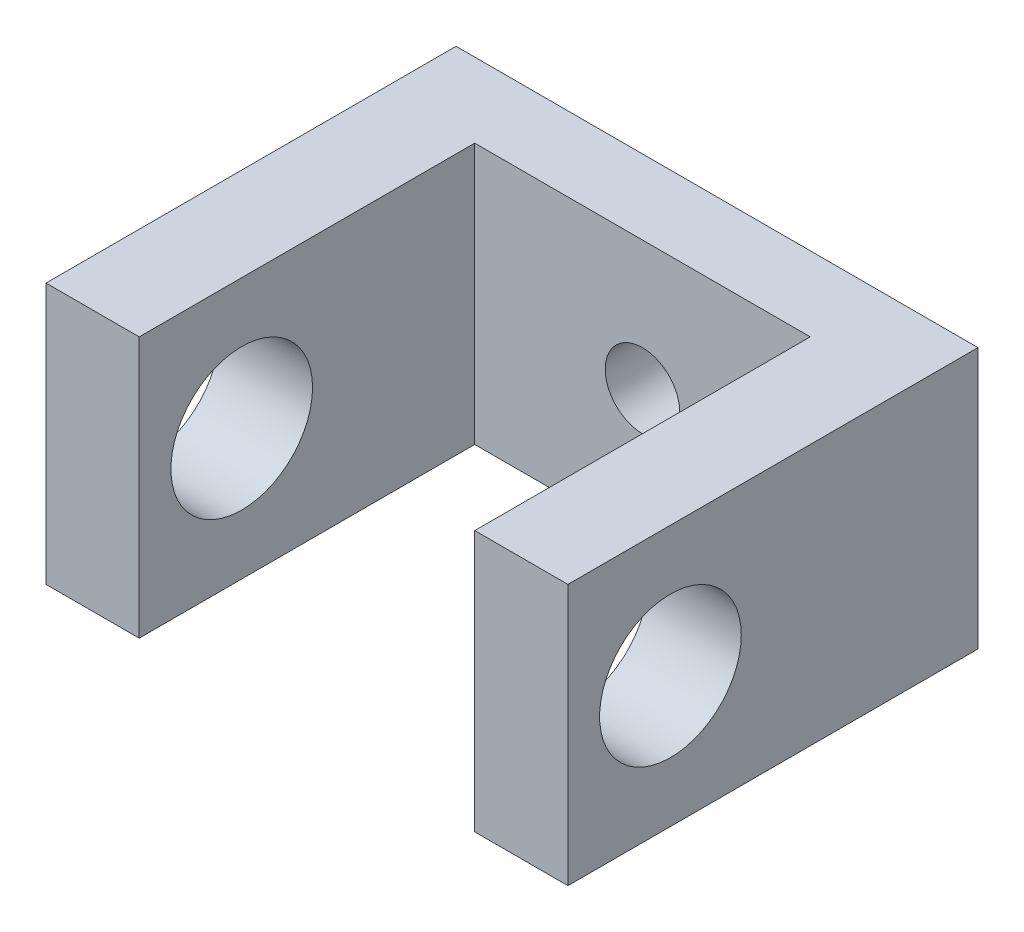
ISO-10303-21;
HEADER;
FILE_DESCRIPTION(('STEP AP214'),'2;1');
FILE_NAME('part.step','',(''),(''),'','','');
FILE_SCHEMA(('AUTOMOTIVE_DESIGN { 1 0 10303 214 1 1 1 1 }'));
ENDSEC;
DATA;
#1=APPLICATION_CONTEXT('core data for automotive mechanical design processes');
#2=APPLICATION_PROTOCOL_DEFINITION('international standard','automotive_design',2000,#1);
#3=PRODUCT_CONTEXT('',#1,'mechanical');
#4=PRODUCT('Part','Part','',(#3));
#5=PRODUCT_RELATED_PRODUCT_CATEGORY('part','',(#4));
#6=PRODUCT_DEFINITION_FORMATION('','',#4);
#7=PRODUCT_DEFINITION_CONTEXT('part definition',#1,'design');
#8=PRODUCT_DEFINITION('design','',#6,#7);
#9=PRODUCT_DEFINITION_SHAPE('','',#8);
#10=(LENGTH_UNIT() NAMED_UNIT(*) SI_UNIT(.MILLI.,.METRE.));
#11=(NAMED_UNIT(*) PLANE_ANGLE_UNIT() SI_UNIT($,.RADIAN.));
#12=(NAMED_UNIT(*) SI_UNIT($,.STERADIAN.) SOLID_ANGLE_UNIT());
#13=UNCERTAINTY_MEASURE_WITH_UNIT(LENGTH_MEASURE(1.E-05),#10,'distance_accuracy_value','');
#14=(GEOMETRIC_REPRESENTATION_CONTEXT(3) GLOBAL_UNCERTAINTY_ASSIGNED_CONTEXT((#13)) GLOBAL_UNIT_ASSIGNED_CONTEXT((#10,
#11,#12)) REPRESENTATION_CONTEXT('',''));
#15=CARTESIAN_POINT('',(0.,0.,0.));
#16=DIRECTION('',(0.,0.,1.));
#17=DIRECTION('',(1.,0.,0.));
#18=AXIS2_PLACEMENT_3D('',#15,#16,#17);
#19=CARTESIAN_POINT('',(0.,0.,22.));
#20=DIRECTION('',(0.,0.,-1.));
#21=DIRECTION('',(-1.,0.,0.));
#22=AXIS2_PLACEMENT_3D('',#19,#20,#21);
#23=PLANE('',#22);
#24=DIRECTION('',(1.,0.,0.));
#25=VECTOR('',#24,1.);
#26=CARTESIAN_POINT('',(-14.,-7.,22.));
#27=LINE('',#26,#25);
#28=CARTESIAN_POINT('',(-14.,-7.,22.));
#29=VERTEX_POINT('',#28);
#30=CARTESIAN_POINT('',(-9.,-7.,22.));
#31=VERTEX_POINT('',#30);
#32=EDGE_CURVE('E165',#29,#31,#27,.T.);
#33=ORIENTED_EDGE('',*,*,#32,.T.);
#34=DIRECTION('',(0.,1.,0.));
#35=VECTOR('',#34,1.);
#36=CARTESIAN_POINT('',(-9.,0.,22.));
#37=LINE('',#36,#35);
#38=CARTESIAN_POINT('',(-9.,7.,22.));
#39=VERTEX_POINT('',#38);
#40=EDGE_CURVE('E11',#31,#39,#37,.T.);
#41=ORIENTED_EDGE('',*,*,#40,.T.);
#42=DIRECTION('',(-1.,0.,0.));
#43=VECTOR('',#42,1.);
#44=CARTESIAN_POINT('',(-14.,7.,22.));
#45=LINE('',#44,#43);
#46=CARTESIAN_POINT('',(-14.,7.,22.));
#47=VERTEX_POINT('',#46);
#48=EDGE_CURVE('E159',#39,#47,#45,.T.);
#49=ORIENTED_EDGE('',*,*,#48,.T.);
#50=DIRECTION('',(0.,-1.,0.));
#51=VECTOR('',#50,1.);
#52=CARTESIAN_POINT('',(-14.,-7.,22.));
#53=LINE('',#52,#51);
#54=EDGE_CURVE('E162',#47,#29,#53,.T.);
#55=ORIENTED_EDGE('',*,*,#54,.T.);
#56=EDGE_LOOP('',(#33,#41,#49,#55));
#57=FACE_BOUND('',#56,.T.);
#58=ADVANCED_FACE('F39',(#57),#23,.F.);
#59=CARTESIAN_POINT('',(14.,-7.,22.));
#60=DIRECTION('',(-1.,0.,0.));
#61=DIRECTION('',(0.,0.,1.));
#62=AXIS2_PLACEMENT_3D('',#59,#60,#61);
#63=PLANE('',#62);
#64=CARTESIAN_POINT('',(14.,0.,16.5));
#65=DIRECTION('',(1.,0.,0.));
#66=DIRECTION('',(0.,0.,-1.));
#67=AXIS2_PLACEMENT_3D('',#64,#65,#66);
#68=CIRCLE('',#67,3.8);
#69=CARTESIAN_POINT('',(14.,0.,12.7));
#70=VERTEX_POINT('',#69);
#71=EDGE_CURVE('E220',#70,#70,#68,.T.);
#72=ORIENTED_EDGE('',*,*,#71,.F.);
#73=EDGE_LOOP('',(#72));
#74=FACE_BOUND('',#73,.T.);
#75=DIRECTION('',(0.,1.,0.));
#76=VECTOR('',#75,1.);
#77=CARTESIAN_POINT('',(14.,-7.,0.));
#78=LINE('',#77,#76);
#79=CARTESIAN_POINT('',(14.,-7.,0.));
#80=VERTEX_POINT('',#79);
#81=CARTESIAN_POINT('',(14.,7.,0.));
#82=VERTEX_POINT('',#81);
#83=EDGE_CURVE('E155',#80,#82,#78,.T.);
#84=ORIENTED_EDGE('',*,*,#83,.T.);
#85=DIRECTION('',(0.,0.,-1.));
#86=VECTOR('',#85,1.);
#87=CARTESIAN_POINT('',(14.,7.,22.));
#88=LINE('',#87,#86);
#89=CARTESIAN_POINT('',(14.,7.,22.));
#90=VERTEX_POINT('',#89);
#91=EDGE_CURVE('E189',#90,#82,#88,.T.);
#92=ORIENTED_EDGE('',*,*,#91,.F.);
#93=DIRECTION('',(0.,1.,0.));
#94=VECTOR('',#93,1.);
#95=CARTESIAN_POINT('',(14.,-7.,22.));
#96=LINE('',#95,#94);
#97=CARTESIAN_POINT('',(14.,-7.,22.));
#98=VERTEX_POINT('',#97);
#99=EDGE_CURVE('E156',#98,#90,#96,.T.);
#100=ORIENTED_EDGE('',*,*,#99,.F.);
#101=DIRECTION('',(0.,0.,-1.));
#102=VECTOR('',#101,1.);
#103=CARTESIAN_POINT('',(14.,-7.,22.));
#104=LINE('',#103,#102);
#105=EDGE_CURVE('E168',#98,#80,#104,.T.);
#106=ORIENTED_EDGE('',*,*,#105,.T.);
#107=EDGE_LOOP('',(#84,#92,#100,#106));
#108=FACE_BOUND('',#107,.T.);
#109=ADVANCED_FACE('F41',(#74,#108),#63,.F.);
#110=CARTESIAN_POINT('',(-14.,7.,22.));
#111=DIRECTION('',(0.,-1.,0.));
#112=DIRECTION('',(0.,0.,-1.));
#113=AXIS2_PLACEMENT_3D('',#110,#111,#112);
#114=PLANE('',#113);
#115=ORIENTED_EDGE('',*,*,#48,.F.);
#116=DIRECTION('',(0.,0.,-1.));
#117=VECTOR('',#116,1.);
#118=CARTESIAN_POINT('',(-9.,7.,22.));
#119=LINE('',#118,#117);
#120=CARTESIAN_POINT('',(-9.,7.,4.));
#121=VERTEX_POINT('',#120);
#122=EDGE_CURVE('E150',#39,#121,#119,.T.);
#123=ORIENTED_EDGE('',*,*,#122,.T.);
#124=DIRECTION('',(1.,0.,0.));
#125=VECTOR('',#124,1.);
#126=CARTESIAN_POINT('',(-14.,7.,4.));
#127=LINE('',#126,#125);
#128=CARTESIAN_POINT('',(9.,7.,4.));
#129=VERTEX_POINT('',#128);
#130=EDGE_CURVE('E124',#121,#129,#127,.T.);
#131=ORIENTED_EDGE('',*,*,#130,.T.);
#132=DIRECTION('',(0.,0.,1.));
#133=VECTOR('',#132,1.);
#134=CARTESIAN_POINT('',(9.,7.,22.));
#135=LINE('',#134,#133);
#136=CARTESIAN_POINT('',(9.,7.,22.));
#137=VERTEX_POINT('',#136);
#138=EDGE_CURVE('E146',#129,#137,#135,.T.);
#139=ORIENTED_EDGE('',*,*,#138,.T.);
#140=EDGE_CURVE('E94',#90,#137,#45,.T.);
#141=ORIENTED_EDGE('',*,*,#140,.F.);
#142=ORIENTED_EDGE('',*,*,#91,.T.);
#143=DIRECTION('',(-1.,0.,0.));
#144=VECTOR('',#143,1.);
#145=CARTESIAN_POINT('',(-14.,7.,0.));
#146=LINE('',#145,#144);
#147=CARTESIAN_POINT('',(-14.,7.,0.));
#148=VERTEX_POINT('',#147);
#149=EDGE_CURVE('E172',#82,#148,#146,.T.);
#150=ORIENTED_EDGE('',*,*,#149,.T.);
#151=DIRECTION('',(0.,0.,-1.));
#152=VECTOR('',#151,1.);
#153=CARTESIAN_POINT('',(-14.,7.,22.));
#154=LINE('',#153,#152);
#155=EDGE_CURVE('E185',#47,#148,#154,.T.);
#156=ORIENTED_EDGE('',*,*,#155,.F.);
#157=EDGE_LOOP('',(#115,#123,#131,#139,#141,#142,#150,#156));
#158=FACE_BOUND('',#157,.T.);
#159=ADVANCED_FACE('F202',(#158),#114,.F.);
#160=CARTESIAN_POINT('',(-14.,-7.,22.));
#161=DIRECTION('',(1.,0.,0.));
#162=DIRECTION('',(0.,0.,-1.));
#163=AXIS2_PLACEMENT_3D('',#160,#161,#162);
#164=PLANE('',#163);
#165=CARTESIAN_POINT('',(-14.,0.,16.5));
#166=DIRECTION('',(1.,0.,0.));
#167=DIRECTION('',(0.,0.,-1.));
#168=AXIS2_PLACEMENT_3D('',#165,#166,#167);
#169=CIRCLE('',#168,3.8);
#170=CARTESIAN_POINT('',(-14.,0.,12.7));
#171=VERTEX_POINT('',#170);
#172=EDGE_CURVE('E136',#171,#171,#169,.T.);
#173=ORIENTED_EDGE('',*,*,#172,.T.);
#174=EDGE_LOOP('',(#173));
#175=FACE_BOUND('',#174,.T.);
#176=DIRECTION('',(0.,-1.,0.));
#177=VECTOR('',#176,1.);
#178=CARTESIAN_POINT('',(-14.,-7.,0.));
#179=LINE('',#178,#177);
#180=CARTESIAN_POINT('',(-14.,-7.,0.));
#181=VERTEX_POINT('',#180);
#182=EDGE_CURVE('E175',#148,#181,#179,.T.);
#183=ORIENTED_EDGE('',*,*,#182,.T.);
#184=DIRECTION('',(0.,0.,-1.));
#185=VECTOR('',#184,1.);
#186=CARTESIAN_POINT('',(-14.,-7.,22.));
#187=LINE('',#186,#185);
#188=EDGE_CURVE('E182',#29,#181,#187,.T.);
#189=ORIENTED_EDGE('',*,*,#188,.F.);
#190=ORIENTED_EDGE('',*,*,#54,.F.);
#191=ORIENTED_EDGE('',*,*,#155,.T.);
#192=EDGE_LOOP('',(#183,#189,#190,#191));
#193=FACE_BOUND('',#192,.T.);
#194=ADVANCED_FACE('F205',(#175,#193),#164,.F.);
#195=CARTESIAN_POINT('',(-14.,-7.,22.));
#196=DIRECTION('',(0.,1.,0.));
#197=DIRECTION('',(0.,0.,1.));
#198=AXIS2_PLACEMENT_3D('',#195,#196,#197);
#199=PLANE('',#198);
#200=DIRECTION('',(1.,0.,0.));
#201=VECTOR('',#200,1.);
#202=CARTESIAN_POINT('',(9.,-7.,4.));
#203=LINE('',#202,#201);
#204=CARTESIAN_POINT('',(-9.,-7.,4.));
#205=VERTEX_POINT('',#204);
#206=CARTESIAN_POINT('',(9.,-7.,4.));
#207=VERTEX_POINT('',#206);
#208=EDGE_CURVE('E122',#205,#207,#203,.T.);
#209=ORIENTED_EDGE('',*,*,#208,.F.);
#210=DIRECTION('',(0.,0.,-1.));
#211=VECTOR('',#210,1.);
#212=CARTESIAN_POINT('',(-9.,-7.,4.));
#213=LINE('',#212,#211);
#214=EDGE_CURVE('E131',#31,#205,#213,.T.);
#215=ORIENTED_EDGE('',*,*,#214,.F.);
#216=ORIENTED_EDGE('',*,*,#32,.F.);
#217=ORIENTED_EDGE('',*,*,#188,.T.);
#218=DIRECTION('',(1.,0.,0.));
#219=VECTOR('',#218,1.);
#220=CARTESIAN_POINT('',(-14.,-7.,0.));
#221=LINE('',#220,#219);
#222=EDGE_CURVE('E86',#181,#80,#221,.T.);
#223=ORIENTED_EDGE('',*,*,#222,.T.);
#224=ORIENTED_EDGE('',*,*,#105,.F.);
#225=CARTESIAN_POINT('',(9.,-7.,22.));
#226=VERTEX_POINT('',#225);
#227=EDGE_CURVE('E64',#226,#98,#27,.T.);
#228=ORIENTED_EDGE('',*,*,#227,.F.);
#229=DIRECTION('',(0.,0.,1.));
#230=VECTOR('',#229,1.);
#231=CARTESIAN_POINT('',(9.,-7.,22.));
#232=LINE('',#231,#230);
#233=EDGE_CURVE('E56',#207,#226,#232,.T.);
#234=ORIENTED_EDGE('',*,*,#233,.F.);
#235=EDGE_LOOP('',(#209,#215,#216,#217,#223,#224,#228,#234));
#236=FACE_BOUND('',#235,.T.);
#237=ADVANCED_FACE('F138',(#236),#199,.F.);
#238=ORIENTED_EDGE('',*,*,#140,.T.);
#239=DIRECTION('',(0.,-1.,0.));
#240=VECTOR('',#239,1.);
#241=CARTESIAN_POINT('',(9.,0.,22.));
#242=LINE('',#241,#240);
#243=EDGE_CURVE('E49',#137,#226,#242,.T.);
#244=ORIENTED_EDGE('',*,*,#243,.T.);
#245=ORIENTED_EDGE('',*,*,#227,.T.);
#246=ORIENTED_EDGE('',*,*,#99,.T.);
#247=EDGE_LOOP('',(#238,#244,#245,#246));
#248=FACE_BOUND('',#247,.T.);
#249=ADVANCED_FACE('F193',(#248),#23,.F.);
#250=CARTESIAN_POINT('',(0.,0.,0.));
#251=DIRECTION('',(0.,0.,-1.));
#252=DIRECTION('',(-1.,0.,0.));
#253=AXIS2_PLACEMENT_3D('',#250,#251,#252);
#254=PLANE('',#253);
#255=CARTESIAN_POINT('',(0.,0.,0.));
#256=DIRECTION('',(0.,0.,-1.));
#257=DIRECTION('',(-1.,0.,0.));
#258=AXIS2_PLACEMENT_3D('',#255,#256,#257);
#259=CIRCLE('',#258,2.);
#260=CARTESIAN_POINT('',(2.,0.,0.));
#261=VERTEX_POINT('',#260);
#262=EDGE_CURVE('E223',#261,#261,#259,.T.);
#263=ORIENTED_EDGE('',*,*,#262,.F.);
#264=EDGE_LOOP('',(#263));
#265=FACE_BOUND('',#264,.T.);
#266=ORIENTED_EDGE('',*,*,#83,.F.);
#267=ORIENTED_EDGE('',*,*,#222,.F.);
#268=ORIENTED_EDGE('',*,*,#182,.F.);
#269=ORIENTED_EDGE('',*,*,#149,.F.);
#270=EDGE_LOOP('',(#266,#267,#268,#269));
#271=FACE_BOUND('',#270,.T.);
#272=ADVANCED_FACE('F208',(#265,#271),#254,.T.);
#273=CARTESIAN_POINT('',(9.,15.,4.));
#274=DIRECTION('',(0.,0.,-1.));
#275=DIRECTION('',(-1.,0.,0.));
#276=AXIS2_PLACEMENT_3D('',#273,#274,#275);
#277=PLANE('',#276);
#278=CARTESIAN_POINT('',(0.,0.,4.));
#279=DIRECTION('',(0.,0.,1.));
#280=DIRECTION('',(1.,0.,0.));
#281=AXIS2_PLACEMENT_3D('',#278,#279,#280);
#282=CIRCLE('',#281,2.);
#283=CARTESIAN_POINT('',(2.,0.,4.));
#284=VERTEX_POINT('',#283);
#285=EDGE_CURVE('E230',#284,#284,#282,.T.);
#286=ORIENTED_EDGE('',*,*,#285,.F.);
#287=EDGE_LOOP('',(#286));
#288=FACE_BOUND('',#287,.T.);
#289=DIRECTION('',(0.,-1.,0.));
#290=VECTOR('',#289,1.);
#291=CARTESIAN_POINT('',(-9.,15.,4.));
#292=LINE('',#291,#290);
#293=EDGE_CURVE('E117',#121,#205,#292,.T.);
#294=ORIENTED_EDGE('',*,*,#293,.T.);
#295=ORIENTED_EDGE('',*,*,#208,.T.);
#296=DIRECTION('',(0.,-1.,0.));
#297=VECTOR('',#296,1.);
#298=CARTESIAN_POINT('',(9.,15.,4.));
#299=LINE('',#298,#297);
#300=EDGE_CURVE('E128',#129,#207,#299,.T.);
#301=ORIENTED_EDGE('',*,*,#300,.F.);
#302=ORIENTED_EDGE('',*,*,#130,.F.);
#303=EDGE_LOOP('',(#294,#295,#301,#302));
#304=FACE_BOUND('',#303,.T.);
#305=ADVANCED_FACE('F119',(#288,#304),#277,.F.);
#306=CARTESIAN_POINT('',(-9.,15.,4.));
#307=DIRECTION('',(-1.,0.,0.));
#308=DIRECTION('',(0.,0.,1.));
#309=AXIS2_PLACEMENT_3D('',#306,#307,#308);
#310=PLANE('',#309);
#311=CARTESIAN_POINT('',(-9.,0.,16.5));
#312=DIRECTION('',(-1.,0.,0.));
#313=DIRECTION('',(0.,0.,1.));
#314=AXIS2_PLACEMENT_3D('',#311,#312,#313);
#315=CIRCLE('',#314,3.8);
#316=CARTESIAN_POINT('',(-9.,0.,12.7));
#317=VERTEX_POINT('',#316);
#318=EDGE_CURVE('E228',#317,#317,#315,.T.);
#319=ORIENTED_EDGE('',*,*,#318,.T.);
#320=EDGE_LOOP('',(#319));
#321=FACE_BOUND('',#320,.T.);
#322=ORIENTED_EDGE('',*,*,#40,.F.);
#323=ORIENTED_EDGE('',*,*,#214,.T.);
#324=ORIENTED_EDGE('',*,*,#293,.F.);
#325=ORIENTED_EDGE('',*,*,#122,.F.);
#326=EDGE_LOOP('',(#322,#323,#324,#325));
#327=FACE_BOUND('',#326,.T.);
#328=ADVANCED_FACE('F132',(#321,#327),#310,.F.);
#329=CARTESIAN_POINT('',(9.,15.,22.));
#330=DIRECTION('',(1.,0.,0.));
#331=DIRECTION('',(0.,0.,-1.));
#332=AXIS2_PLACEMENT_3D('',#329,#330,#331);
#333=PLANE('',#332);
#334=CARTESIAN_POINT('',(9.,0.,16.5));
#335=DIRECTION('',(1.,0.,0.));
#336=DIRECTION('',(0.,0.,-1.));
#337=AXIS2_PLACEMENT_3D('',#334,#335,#336);
#338=CIRCLE('',#337,3.8);
#339=CARTESIAN_POINT('',(9.,0.,12.7));
#340=VERTEX_POINT('',#339);
#341=EDGE_CURVE('E43',#340,#340,#338,.T.);
#342=ORIENTED_EDGE('',*,*,#341,.T.);
#343=EDGE_LOOP('',(#342));
#344=FACE_BOUND('',#343,.T.);
#345=ORIENTED_EDGE('',*,*,#300,.T.);
#346=ORIENTED_EDGE('',*,*,#233,.T.);
#347=ORIENTED_EDGE('',*,*,#243,.F.);
#348=ORIENTED_EDGE('',*,*,#138,.F.);
#349=EDGE_LOOP('',(#345,#346,#347,#348));
#350=FACE_BOUND('',#349,.T.);
#351=ADVANCED_FACE('F253',(#344,#350),#333,.F.);
#352=CARTESIAN_POINT('',(-15.,0.,16.5));
#353=DIRECTION('',(1.,0.,0.));
#354=DIRECTION('',(0.,0.,-1.));
#355=AXIS2_PLACEMENT_3D('',#352,#353,#354);
#356=CYLINDRICAL_SURFACE('',#355,3.8);
#357=CARTESIAN_POINT('',(14.,0.,12.7));
#358=CARTESIAN_POINT('',(13.9479166666667,0.,12.7));
#359=CARTESIAN_POINT('',(13.8958333333333,0.,12.7));
#360=CARTESIAN_POINT('',(13.7916666666667,0.,12.7));
#361=CARTESIAN_POINT('',(13.7395833333333,0.,12.7));
#362=CARTESIAN_POINT('',(13.6354166666667,0.,12.7));
#363=CARTESIAN_POINT('',(13.5833333333333,0.,12.7));
#364=CARTESIAN_POINT('',(13.4791666666667,0.,12.7));
#365=CARTESIAN_POINT('',(13.4270833333333,0.,12.7));
#366=CARTESIAN_POINT('',(13.3229166666667,0.,12.7));
#367=CARTESIAN_POINT('',(13.2708333333333,0.,12.7));
#368=CARTESIAN_POINT('',(13.1666666666667,0.,12.7));
#369=CARTESIAN_POINT('',(13.1145833333333,0.,12.7));
#370=CARTESIAN_POINT('',(13.0104166666667,0.,12.7));
#371=CARTESIAN_POINT('',(12.9583333333333,0.,12.7));
#372=CARTESIAN_POINT('',(12.8541666666667,0.,12.7));
#373=CARTESIAN_POINT('',(12.8020833333333,0.,12.7));
#374=CARTESIAN_POINT('',(12.6979166666667,0.,12.7));
#375=CARTESIAN_POINT('',(12.6458333333333,0.,12.7));
#376=CARTESIAN_POINT('',(12.5416666666667,0.,12.7));
#377=CARTESIAN_POINT('',(12.4895833333333,0.,12.7));
#378=CARTESIAN_POINT('',(12.3854166666667,0.,12.7));
#379=CARTESIAN_POINT('',(12.3333333333333,0.,12.7));
#380=CARTESIAN_POINT('',(12.2291666666667,0.,12.7));
#381=CARTESIAN_POINT('',(12.1770833333333,0.,12.7));
#382=CARTESIAN_POINT('',(12.0729166666667,0.,12.7));
#383=CARTESIAN_POINT('',(12.0208333333333,0.,12.7));
#384=CARTESIAN_POINT('',(11.9166666666667,0.,12.7));
#385=CARTESIAN_POINT('',(11.8645833333333,0.,12.7));
#386=CARTESIAN_POINT('',(11.7604166666667,0.,12.7));
#387=CARTESIAN_POINT('',(11.7083333333333,0.,12.7));
#388=CARTESIAN_POINT('',(11.6041666666667,0.,12.7));
#389=CARTESIAN_POINT('',(11.5520833333333,0.,12.7));
#390=CARTESIAN_POINT('',(11.4479166666667,0.,12.7));
#391=CARTESIAN_POINT('',(11.3958333333333,0.,12.7));
#392=CARTESIAN_POINT('',(11.2916666666667,0.,12.7));
#393=CARTESIAN_POINT('',(11.2395833333333,0.,12.7));
#394=CARTESIAN_POINT('',(11.1354166666667,0.,12.7));
#395=CARTESIAN_POINT('',(11.0833333333333,0.,12.7));
#396=CARTESIAN_POINT('',(10.9791666666667,0.,12.7));
#397=CARTESIAN_POINT('',(10.9270833333333,0.,12.7));
#398=CARTESIAN_POINT('',(10.8229166666667,0.,12.7));
#399=CARTESIAN_POINT('',(10.7708333333333,0.,12.7));
#400=CARTESIAN_POINT('',(10.6666666666667,0.,12.7));
#401=CARTESIAN_POINT('',(10.6145833333333,0.,12.7));
#402=CARTESIAN_POINT('',(10.5104166666667,0.,12.7));
#403=CARTESIAN_POINT('',(10.4583333333333,0.,12.7));
#404=CARTESIAN_POINT('',(10.3541666666667,0.,12.7));
#405=CARTESIAN_POINT('',(10.3020833333333,0.,12.7));
#406=CARTESIAN_POINT('',(10.1979166666667,0.,12.7));
#407=CARTESIAN_POINT('',(10.1458333333333,0.,12.7));
#408=CARTESIAN_POINT('',(10.0416666666667,0.,12.7));
#409=CARTESIAN_POINT('',(9.98958333333333,0.,12.7));
#410=CARTESIAN_POINT('',(9.88541666666667,0.,12.7));
#411=CARTESIAN_POINT('',(9.83333333333333,0.,12.7));
#412=CARTESIAN_POINT('',(9.72916666666667,0.,12.7));
#413=CARTESIAN_POINT('',(9.67708333333333,0.,12.7));
#414=CARTESIAN_POINT('',(9.57291666666667,0.,12.7));
#415=CARTESIAN_POINT('',(9.52083333333333,0.,12.7));
#416=CARTESIAN_POINT('',(9.41666666666667,0.,12.7));
#417=CARTESIAN_POINT('',(9.36458333333333,0.,12.7));
#418=CARTESIAN_POINT('',(9.26041666666667,0.,12.7));
#419=CARTESIAN_POINT('',(9.20833333333333,0.,12.7));
#420=CARTESIAN_POINT('',(9.10416666666667,0.,12.7));
#421=CARTESIAN_POINT('',(9.05208333333333,0.,12.7));
#422=CARTESIAN_POINT('',(9.,0.,12.7));
#423=B_SPLINE_CURVE_WITH_KNOTS('',3,(#357,#358,#359,#360,#361,#362,#363,#364,#365,#366,#367,
#368,#369,#370,#371,#372,#373,#374,#375,#376,#377,#378,#379,#380,#381,#382,#383,#384,#385,#386,
#387,#388,#389,#390,#391,#392,#393,#394,#395,#396,#397,#398,#399,#400,#401,#402,#403,#404,#405,
#406,#407,#408,#409,#410,#411,#412,#413,#414,#415,#416,#417,#418,#419,#420,#421,#422),
.UNSPECIFIED.,.F.,.F.,(4,2,2,2,2,2,2,2,2,2,2,2,2,2,2,2,2,2,2,2,2,2,2,2,2,2,2,2,2,2,2,2,4),(0.,
0.15625,0.3125,0.46875,0.625000000000001,0.781250000000001,0.937500000000001,1.09375,1.25,
1.40625,1.5625,1.71875,1.875,2.03125,2.1875,2.34375,2.5,2.65625,2.8125,2.96875,3.125,3.28125,
3.4375,3.59375,3.75,3.90625,4.0625,4.21875,4.375,4.53125,4.6875,4.84375,5.),.UNSPECIFIED.);
#424=EDGE_CURVE('BSEAM244',#70,#340,#423,.T.);
#425=ORIENTED_EDGE('',*,*,#71,.T.);
#426=ORIENTED_EDGE('',*,*,#341,.F.);
#427=ORIENTED_EDGE('',*,*,#424,.T.);
#428=ORIENTED_EDGE('',*,*,#424,.F.);
#429=EDGE_LOOP('',(#425,#427,#426,#428));
#430=FACE_BOUND('',#429,.T.);
#431=ADVANCED_FACE('F244',(#430),#356,.F.);
#432=CARTESIAN_POINT('',(-9.,0.,12.7));
#433=CARTESIAN_POINT('',(-9.05208333333333,0.,12.7));
#434=CARTESIAN_POINT('',(-9.10416666666667,0.,12.7));
#435=CARTESIAN_POINT('',(-9.20833333333333,0.,12.7));
#436=CARTESIAN_POINT('',(-9.26041666666667,0.,12.7));
#437=CARTESIAN_POINT('',(-9.36458333333333,0.,12.7));
#438=CARTESIAN_POINT('',(-9.41666666666667,0.,12.7));
#439=CARTESIAN_POINT('',(-9.52083333333333,0.,12.7));
#440=CARTESIAN_POINT('',(-9.57291666666667,0.,12.7));
#441=CARTESIAN_POINT('',(-9.67708333333333,0.,12.7));
#442=CARTESIAN_POINT('',(-9.72916666666667,0.,12.7));
#443=CARTESIAN_POINT('',(-9.83333333333333,0.,12.7));
#444=CARTESIAN_POINT('',(-9.88541666666667,0.,12.7));
#445=CARTESIAN_POINT('',(-9.98958333333333,0.,12.7));
#446=CARTESIAN_POINT('',(-10.0416666666667,0.,12.7));
#447=CARTESIAN_POINT('',(-10.1458333333333,0.,12.7));
#448=CARTESIAN_POINT('',(-10.1979166666667,0.,12.7));
#449=CARTESIAN_POINT('',(-10.3020833333333,0.,12.7));
#450=CARTESIAN_POINT('',(-10.3541666666667,0.,12.7));
#451=CARTESIAN_POINT('',(-10.4583333333333,0.,12.7));
#452=CARTESIAN_POINT('',(-10.5104166666667,0.,12.7));
#453=CARTESIAN_POINT('',(-10.6145833333333,0.,12.7));
#454=CARTESIAN_POINT('',(-10.6666666666667,0.,12.7));
#455=CARTESIAN_POINT('',(-10.7708333333333,0.,12.7));
#456=CARTESIAN_POINT('',(-10.8229166666667,0.,12.7));
#457=CARTESIAN_POINT('',(-10.9270833333333,0.,12.7));
#458=CARTESIAN_POINT('',(-10.9791666666667,0.,12.7));
#459=CARTESIAN_POINT('',(-11.0833333333333,0.,12.7));
#460=CARTESIAN_POINT('',(-11.1354166666667,0.,12.7));
#461=CARTESIAN_POINT('',(-11.2395833333333,0.,12.7));
#462=CARTESIAN_POINT('',(-11.2916666666667,0.,12.7));
#463=CARTESIAN_POINT('',(-11.3958333333333,0.,12.7));
#464=CARTESIAN_POINT('',(-11.4479166666667,0.,12.7));
#465=CARTESIAN_POINT('',(-11.5520833333333,0.,12.7));
#466=CARTESIAN_POINT('',(-11.6041666666667,0.,12.7));
#467=CARTESIAN_POINT('',(-11.7083333333333,0.,12.7));
#468=CARTESIAN_POINT('',(-11.7604166666667,0.,12.7));
#469=CARTESIAN_POINT('',(-11.8645833333333,0.,12.7));
#470=CARTESIAN_POINT('',(-11.9166666666667,0.,12.7));
#471=CARTESIAN_POINT('',(-12.0208333333333,0.,12.7));
#472=CARTESIAN_POINT('',(-12.0729166666667,0.,12.7));
#473=CARTESIAN_POINT('',(-12.1770833333333,0.,12.7));
#474=CARTESIAN_POINT('',(-12.2291666666667,0.,12.7));
#475=CARTESIAN_POINT('',(-12.3333333333333,0.,12.7));
#476=CARTESIAN_POINT('',(-12.3854166666667,0.,12.7));
#477=CARTESIAN_POINT('',(-12.4895833333333,0.,12.7));
#478=CARTESIAN_POINT('',(-12.5416666666667,0.,12.7));
#479=CARTESIAN_POINT('',(-12.6458333333333,0.,12.7));
#480=CARTESIAN_POINT('',(-12.6979166666667,0.,12.7));
#481=CARTESIAN_POINT('',(-12.8020833333333,0.,12.7));
#482=CARTESIAN_POINT('',(-12.8541666666667,0.,12.7));
#483=CARTESIAN_POINT('',(-12.9583333333333,0.,12.7));
#484=CARTESIAN_POINT('',(-13.0104166666667,0.,12.7));
#485=CARTESIAN_POINT('',(-13.1145833333333,0.,12.7));
#486=CARTESIAN_POINT('',(-13.1666666666667,0.,12.7));
#487=CARTESIAN_POINT('',(-13.2708333333333,0.,12.7));
#488=CARTESIAN_POINT('',(-13.3229166666667,0.,12.7));
#489=CARTESIAN_POINT('',(-13.4270833333333,0.,12.7));
#490=CARTESIAN_POINT('',(-13.4791666666667,0.,12.7));
#491=CARTESIAN_POINT('',(-13.5833333333333,0.,12.7));
#492=CARTESIAN_POINT('',(-13.6354166666667,0.,12.7));
#493=CARTESIAN_POINT('',(-13.7395833333333,0.,12.7));
#494=CARTESIAN_POINT('',(-13.7916666666667,0.,12.7));
#495=CARTESIAN_POINT('',(-13.8958333333333,0.,12.7));
#496=CARTESIAN_POINT('',(-13.9479166666667,0.,12.7));
#497=CARTESIAN_POINT('',(-14.,0.,12.7));
#498=B_SPLINE_CURVE_WITH_KNOTS('',3,(#432,#433,#434,#435,#436,#437,#438,#439,#440,#441,#442,
#443,#444,#445,#446,#447,#448,#449,#450,#451,#452,#453,#454,#455,#456,#457,#458,#459,#460,#461,
#462,#463,#464,#465,#466,#467,#468,#469,#470,#471,#472,#473,#474,#475,#476,#477,#478,#479,#480,
#481,#482,#483,#484,#485,#486,#487,#488,#489,#490,#491,#492,#493,#494,#495,#496,#497),
.UNSPECIFIED.,.F.,.F.,(4,2,2,2,2,2,2,2,2,2,2,2,2,2,2,2,2,2,2,2,2,2,2,2,2,2,2,2,2,2,2,2,4),(0.,
0.15625,0.3125,0.46875,0.625000000000001,0.781250000000001,0.937500000000001,1.09375,1.25,
1.40625,1.5625,1.71875,1.875,2.03125,2.1875,2.34375,2.5,2.65625,2.8125,2.96875,3.125,3.28125,
3.4375,3.59375,3.75,3.90625,4.0625,4.21875,4.375,4.53125,4.6875,4.84375,5.),.UNSPECIFIED.);
#499=EDGE_CURVE('BSEAM241',#317,#171,#498,.T.);
#500=ORIENTED_EDGE('',*,*,#318,.F.);
#501=ORIENTED_EDGE('',*,*,#172,.F.);
#502=ORIENTED_EDGE('',*,*,#499,.T.);
#503=ORIENTED_EDGE('',*,*,#499,.F.);
#504=EDGE_LOOP('',(#500,#502,#501,#503));
#505=FACE_BOUND('',#504,.T.);
#506=ADVANCED_FACE('F241',(#505),#356,.F.);
#507=CARTESIAN_POINT('',(0.,0.,-25.));
#508=DIRECTION('',(0.,0.,1.));
#509=DIRECTION('',(1.,0.,0.));
#510=AXIS2_PLACEMENT_3D('',#507,#508,#509);
#511=CYLINDRICAL_SURFACE('',#510,2.);
#512=CARTESIAN_POINT('',(2.,0.,0.));
#513=CARTESIAN_POINT('',(2.,0.,0.0416666666666701));
#514=CARTESIAN_POINT('',(2.,0.,0.0833333333333369));
#515=CARTESIAN_POINT('',(2.,0.,0.16666666666667));
#516=CARTESIAN_POINT('',(2.,0.,0.208333333333337));
#517=CARTESIAN_POINT('',(2.,0.,0.29166666666667));
#518=CARTESIAN_POINT('',(2.,0.,0.333333333333337));
#519=CARTESIAN_POINT('',(2.,0.,0.416666666666671));
#520=CARTESIAN_POINT('',(2.,0.,0.458333333333337));
#521=CARTESIAN_POINT('',(2.,0.,0.541666666666671));
#522=CARTESIAN_POINT('',(2.,0.,0.583333333333337));
#523=CARTESIAN_POINT('',(2.,0.,0.666666666666671));
#524=CARTESIAN_POINT('',(2.,0.,0.708333333333337));
#525=CARTESIAN_POINT('',(2.,0.,0.791666666666671));
#526=CARTESIAN_POINT('',(2.,0.,0.833333333333337));
#527=CARTESIAN_POINT('',(2.,0.,0.916666666666671));
#528=CARTESIAN_POINT('',(2.,0.,0.958333333333338));
#529=CARTESIAN_POINT('',(2.,0.,1.04166666666667));
#530=CARTESIAN_POINT('',(2.,0.,1.08333333333334));
#531=CARTESIAN_POINT('',(2.,0.,1.16666666666667));
#532=CARTESIAN_POINT('',(2.,0.,1.20833333333333));
#533=CARTESIAN_POINT('',(2.,0.,1.29166666666667));
#534=CARTESIAN_POINT('',(2.,0.,1.33333333333333));
#535=CARTESIAN_POINT('',(2.,0.,1.41666666666667));
#536=CARTESIAN_POINT('',(2.,0.,1.45833333333333));
#537=CARTESIAN_POINT('',(2.,0.,1.54166666666667));
#538=CARTESIAN_POINT('',(2.,0.,1.58333333333333));
#539=CARTESIAN_POINT('',(2.,0.,1.66666666666667));
#540=CARTESIAN_POINT('',(2.,0.,1.70833333333333));
#541=CARTESIAN_POINT('',(2.,0.,1.79166666666667));
#542=CARTESIAN_POINT('',(2.,0.,1.83333333333334));
#543=CARTESIAN_POINT('',(2.,0.,1.91666666666667));
#544=CARTESIAN_POINT('',(2.,0.,1.95833333333334));
#545=CARTESIAN_POINT('',(2.,0.,2.04166666666667));
#546=CARTESIAN_POINT('',(2.,0.,2.08333333333334));
#547=CARTESIAN_POINT('',(2.,0.,2.16666666666667));
#548=CARTESIAN_POINT('',(2.,0.,2.20833333333334));
#549=CARTESIAN_POINT('',(2.,0.,2.29166666666667));
#550=CARTESIAN_POINT('',(2.,0.,2.33333333333334));
#551=CARTESIAN_POINT('',(2.,0.,2.41666666666667));
#552=CARTESIAN_POINT('',(2.,0.,2.45833333333334));
#553=CARTESIAN_POINT('',(2.,0.,2.54166666666667));
#554=CARTESIAN_POINT('',(2.,0.,2.58333333333334));
#555=CARTESIAN_POINT('',(2.,0.,2.66666666666667));
#556=CARTESIAN_POINT('',(2.,0.,2.70833333333334));
#557=CARTESIAN_POINT('',(2.,0.,2.79166666666667));
#558=CARTESIAN_POINT('',(2.,0.,2.83333333333333));
#559=CARTESIAN_POINT('',(2.,0.,2.91666666666667));
#560=CARTESIAN_POINT('',(2.,0.,2.95833333333333));
#561=CARTESIAN_POINT('',(2.,0.,3.04166666666667));
#562=CARTESIAN_POINT('',(2.,0.,3.08333333333333));
#563=CARTESIAN_POINT('',(2.,0.,3.16666666666667));
#564=CARTESIAN_POINT('',(2.,0.,3.20833333333333));
#565=CARTESIAN_POINT('',(2.,0.,3.29166666666667));
#566=CARTESIAN_POINT('',(2.,0.,3.33333333333333));
#567=CARTESIAN_POINT('',(2.,0.,3.41666666666667));
#568=CARTESIAN_POINT('',(2.,0.,3.45833333333333));
#569=CARTESIAN_POINT('',(2.,0.,3.54166666666667));
#570=CARTESIAN_POINT('',(2.,0.,3.58333333333333));
#571=CARTESIAN_POINT('',(2.,0.,3.66666666666667));
#572=CARTESIAN_POINT('',(2.,0.,3.70833333333333));
#573=CARTESIAN_POINT('',(2.,0.,3.79166666666667));
#574=CARTESIAN_POINT('',(2.,0.,3.83333333333333));
#575=CARTESIAN_POINT('',(2.,0.,3.91666666666667));
#576=CARTESIAN_POINT('',(2.,0.,3.95833333333333));
#577=CARTESIAN_POINT('',(2.,0.,4.));
#578=B_SPLINE_CURVE_WITH_KNOTS('',3,(#512,#513,#514,#515,#516,#517,#518,#519,#520,#521,#522,
#523,#524,#525,#526,#527,#528,#529,#530,#531,#532,#533,#534,#535,#536,#537,#538,#539,#540,#541,
#542,#543,#544,#545,#546,#547,#548,#549,#550,#551,#552,#553,#554,#555,#556,#557,#558,#559,#560,
#561,#562,#563,#564,#565,#566,#567,#568,#569,#570,#571,#572,#573,#574,#575,#576,#577),
.UNSPECIFIED.,.F.,.F.,(4,2,2,2,2,2,2,2,2,2,2,2,2,2,2,2,2,2,2,2,2,2,2,2,2,2,2,2,2,2,2,2,4),(0.,
0.125,0.25,0.375,0.5,0.625000000000001,0.750000000000001,0.875000000000001,1.,1.125,1.25,1.375,
1.5,1.625,1.75,1.875,2.,2.125,2.25,2.375,2.5,2.625,2.75,2.875,3.,3.125,3.25,3.375,3.5,3.625,
3.75,3.875,4.),.UNSPECIFIED.);
#579=EDGE_CURVE('BSEAM243',#261,#284,#578,.T.);
#580=ORIENTED_EDGE('',*,*,#262,.T.);
#581=ORIENTED_EDGE('',*,*,#285,.T.);
#582=ORIENTED_EDGE('',*,*,#579,.T.);
#583=ORIENTED_EDGE('',*,*,#579,.F.);
#584=EDGE_LOOP('',(#580,#582,#581,#583));
#585=FACE_BOUND('',#584,.T.);
#586=ADVANCED_FACE('F243',(#585),#511,.F.);
#587=CLOSED_SHELL('',(#58,#109,#159,#194,#237,#249,#272,#305,#328,#351,#431,#506,#586));
#588=MANIFOLD_SOLID_BREP('B2',#587);
#589=ADVANCED_BREP_SHAPE_REPRESENTATION('',(#18,#588),#14);
#590=SHAPE_DEFINITION_REPRESENTATION(#9,#589);
ENDSEC;
END-ISO-10303-21;
